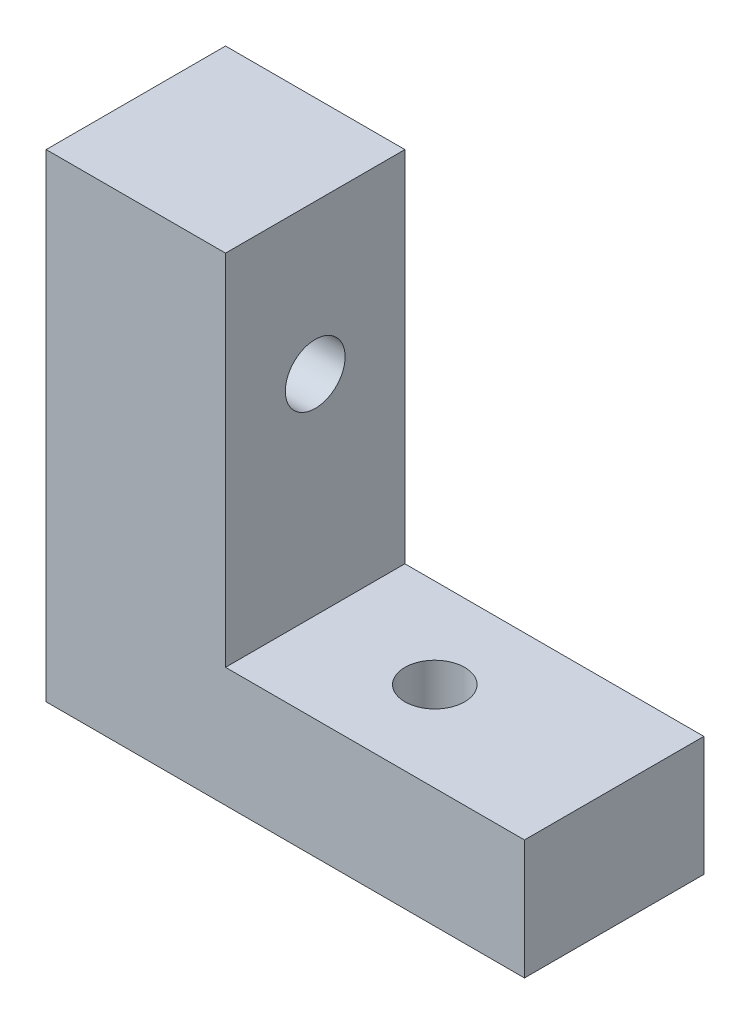
ISO-10303-21;
HEADER;
FILE_DESCRIPTION(('STEP AP214'),'2;1');
FILE_NAME('part.step','',(''),(''),'','','');
FILE_SCHEMA(('AUTOMOTIVE_DESIGN { 1 0 10303 214 1 1 1 1 }'));
ENDSEC;
DATA;
#1=APPLICATION_CONTEXT('core data for automotive mechanical design processes');
#2=APPLICATION_PROTOCOL_DEFINITION('international standard','automotive_design',2000,#1);
#3=PRODUCT_CONTEXT('',#1,'mechanical');
#4=PRODUCT('Part','Part','',(#3));
#5=PRODUCT_RELATED_PRODUCT_CATEGORY('part','',(#4));
#6=PRODUCT_DEFINITION_FORMATION('','',#4);
#7=PRODUCT_DEFINITION_CONTEXT('part definition',#1,'design');
#8=PRODUCT_DEFINITION('design','',#6,#7);
#9=PRODUCT_DEFINITION_SHAPE('','',#8);
#10=(LENGTH_UNIT() NAMED_UNIT(*) SI_UNIT(.MILLI.,.METRE.));
#11=(NAMED_UNIT(*) PLANE_ANGLE_UNIT() SI_UNIT($,.RADIAN.));
#12=(NAMED_UNIT(*) SI_UNIT($,.STERADIAN.) SOLID_ANGLE_UNIT());
#13=UNCERTAINTY_MEASURE_WITH_UNIT(LENGTH_MEASURE(1.E-05),#10,'distance_accuracy_value','');
#14=(GEOMETRIC_REPRESENTATION_CONTEXT(3) GLOBAL_UNCERTAINTY_ASSIGNED_CONTEXT((#13)) GLOBAL_UNIT_ASSIGNED_CONTEXT((#10,
#11,#12)) REPRESENTATION_CONTEXT('',''));
#15=CARTESIAN_POINT('',(0.,0.,0.));
#16=DIRECTION('',(0.,0.,1.));
#17=DIRECTION('',(1.,0.,0.));
#18=AXIS2_PLACEMENT_3D('',#15,#16,#17);
#19=CARTESIAN_POINT('',(0.,0.,30.));
#20=DIRECTION('',(1.,0.,0.));
#21=DIRECTION('',(0.,0.,-1.));
#22=AXIS2_PLACEMENT_3D('',#19,#20,#21);
#23=PLANE('',#22);
#24=CARTESIAN_POINT('',(0.,-25.,15.));
#25=DIRECTION('',(1.,0.,0.));
#26=DIRECTION('',(0.,0.,-1.));
#27=AXIS2_PLACEMENT_3D('',#24,#25,#26);
#28=CIRCLE('',#27,5.);
#29=CARTESIAN_POINT('',(0.,-25.,10.));
#30=VERTEX_POINT('',#29);
#31=EDGE_CURVE('E133',#30,#30,#28,.T.);
#32=ORIENTED_EDGE('',*,*,#31,.T.);
#33=EDGE_LOOP('',(#32));
#34=FACE_BOUND('',#33,.T.);
#35=DIRECTION('',(0.,-1.,0.));
#36=VECTOR('',#35,1.);
#37=CARTESIAN_POINT('',(0.,0.,0.));
#38=LINE('',#37,#36);
#39=CARTESIAN_POINT('',(0.,0.,0.));
#40=VERTEX_POINT('',#39);
#41=CARTESIAN_POINT('',(0.,-80.,0.));
#42=VERTEX_POINT('',#41);
#43=EDGE_CURVE('E128',#40,#42,#38,.T.);
#44=ORIENTED_EDGE('',*,*,#43,.T.);
#45=DIRECTION('',(0.,0.,-1.));
#46=VECTOR('',#45,1.);
#47=CARTESIAN_POINT('',(0.,-80.,30.));
#48=LINE('',#47,#46);
#49=CARTESIAN_POINT('',(0.,-80.,30.));
#50=VERTEX_POINT('',#49);
#51=EDGE_CURVE('E11',#50,#42,#48,.T.);
#52=ORIENTED_EDGE('',*,*,#51,.F.);
#53=DIRECTION('',(0.,-1.,0.));
#54=VECTOR('',#53,1.);
#55=CARTESIAN_POINT('',(0.,0.,30.));
#56=LINE('',#55,#54);
#57=CARTESIAN_POINT('',(0.,0.,30.));
#58=VERTEX_POINT('',#57);
#59=EDGE_CURVE('E145',#58,#50,#56,.T.);
#60=ORIENTED_EDGE('',*,*,#59,.F.);
#61=DIRECTION('',(0.,0.,-1.));
#62=VECTOR('',#61,1.);
#63=CARTESIAN_POINT('',(0.,0.,30.));
#64=LINE('',#63,#62);
#65=EDGE_CURVE('E124',#58,#40,#64,.T.);
#66=ORIENTED_EDGE('',*,*,#65,.T.);
#67=EDGE_LOOP('',(#44,#52,#60,#66));
#68=FACE_BOUND('',#67,.T.);
#69=ADVANCED_FACE('F39',(#34,#68),#23,.F.);
#70=CARTESIAN_POINT('',(30.,-80.,30.));
#71=DIRECTION('',(0.,1.,0.));
#72=DIRECTION('',(0.,0.,1.));
#73=AXIS2_PLACEMENT_3D('',#70,#71,#72);
#74=PLANE('',#73);
#75=CARTESIAN_POINT('',(50.,-80.,15.));
#76=DIRECTION('',(0.,1.,0.));
#77=DIRECTION('',(0.,0.,1.));
#78=AXIS2_PLACEMENT_3D('',#75,#76,#77);
#79=CIRCLE('',#78,5.);
#80=CARTESIAN_POINT('',(50.,-80.,20.));
#81=VERTEX_POINT('',#80);
#82=EDGE_CURVE('E188',#81,#81,#79,.T.);
#83=ORIENTED_EDGE('',*,*,#82,.T.);
#84=EDGE_LOOP('',(#83));
#85=FACE_BOUND('',#84,.T.);
#86=DIRECTION('',(1.,0.,0.));
#87=VECTOR('',#86,1.);
#88=CARTESIAN_POINT('',(30.,-80.,0.));
#89=LINE('',#88,#87);
#90=CARTESIAN_POINT('',(80.,-80.,0.));
#91=VERTEX_POINT('',#90);
#92=EDGE_CURVE('E132',#42,#91,#89,.T.);
#93=ORIENTED_EDGE('',*,*,#92,.T.);
#94=DIRECTION('',(0.,0.,-1.));
#95=VECTOR('',#94,1.);
#96=CARTESIAN_POINT('',(80.,-80.,30.));
#97=LINE('',#96,#95);
#98=CARTESIAN_POINT('',(80.,-80.,30.));
#99=VERTEX_POINT('',#98);
#100=EDGE_CURVE('E48',#99,#91,#97,.T.);
#101=ORIENTED_EDGE('',*,*,#100,.F.);
#102=DIRECTION('',(1.,0.,0.));
#103=VECTOR('',#102,1.);
#104=CARTESIAN_POINT('',(0.,-80.,30.));
#105=LINE('',#104,#103);
#106=EDGE_CURVE('E93',#50,#99,#105,.T.);
#107=ORIENTED_EDGE('',*,*,#106,.F.);
#108=ORIENTED_EDGE('',*,*,#51,.T.);
#109=EDGE_LOOP('',(#93,#101,#107,#108));
#110=FACE_BOUND('',#109,.T.);
#111=ADVANCED_FACE('F174',(#85,#110),#74,.F.);
#112=CARTESIAN_POINT('',(80.,-80.,30.));
#113=DIRECTION('',(-1.,0.,0.));
#114=DIRECTION('',(0.,0.,1.));
#115=AXIS2_PLACEMENT_3D('',#112,#113,#114);
#116=PLANE('',#115);
#117=DIRECTION('',(0.,1.,0.));
#118=VECTOR('',#117,1.);
#119=CARTESIAN_POINT('',(80.,-80.,0.));
#120=LINE('',#119,#118);
#121=CARTESIAN_POINT('',(80.,-60.,0.));
#122=VERTEX_POINT('',#121);
#123=EDGE_CURVE('E136',#91,#122,#120,.T.);
#124=ORIENTED_EDGE('',*,*,#123,.T.);
#125=DIRECTION('',(0.,0.,-1.));
#126=VECTOR('',#125,1.);
#127=CARTESIAN_POINT('',(80.,-60.,30.));
#128=LINE('',#127,#126);
#129=CARTESIAN_POINT('',(80.,-60.,30.));
#130=VERTEX_POINT('',#129);
#131=EDGE_CURVE('E117',#130,#122,#128,.T.);
#132=ORIENTED_EDGE('',*,*,#131,.F.);
#133=DIRECTION('',(0.,1.,0.));
#134=VECTOR('',#133,1.);
#135=CARTESIAN_POINT('',(80.,-80.,30.));
#136=LINE('',#135,#134);
#137=EDGE_CURVE('E106',#99,#130,#136,.T.);
#138=ORIENTED_EDGE('',*,*,#137,.F.);
#139=ORIENTED_EDGE('',*,*,#100,.T.);
#140=EDGE_LOOP('',(#124,#132,#138,#139));
#141=FACE_BOUND('',#140,.T.);
#142=ADVANCED_FACE('F155',(#141),#116,.F.);
#143=CARTESIAN_POINT('',(30.,-60.,30.));
#144=DIRECTION('',(0.,-1.,0.));
#145=DIRECTION('',(0.,0.,-1.));
#146=AXIS2_PLACEMENT_3D('',#143,#144,#145);
#147=PLANE('',#146);
#148=CARTESIAN_POINT('',(50.,-60.,15.));
#149=DIRECTION('',(0.,1.,0.));
#150=DIRECTION('',(0.,0.,1.));
#151=AXIS2_PLACEMENT_3D('',#148,#149,#150);
#152=CIRCLE('',#151,5.);
#153=CARTESIAN_POINT('',(50.,-60.,20.));
#154=VERTEX_POINT('',#153);
#155=EDGE_CURVE('E199',#154,#154,#152,.T.);
#156=ORIENTED_EDGE('',*,*,#155,.F.);
#157=EDGE_LOOP('',(#156));
#158=FACE_BOUND('',#157,.T.);
#159=DIRECTION('',(-1.,0.,0.));
#160=VECTOR('',#159,1.);
#161=CARTESIAN_POINT('',(30.,-60.,0.));
#162=LINE('',#161,#160);
#163=CARTESIAN_POINT('',(30.,-60.,0.));
#164=VERTEX_POINT('',#163);
#165=EDGE_CURVE('E115',#122,#164,#162,.T.);
#166=ORIENTED_EDGE('',*,*,#165,.T.);
#167=DIRECTION('',(0.,0.,-1.));
#168=VECTOR('',#167,1.);
#169=CARTESIAN_POINT('',(30.,-60.,30.));
#170=LINE('',#169,#168);
#171=CARTESIAN_POINT('',(30.,-60.,30.));
#172=VERTEX_POINT('',#171);
#173=EDGE_CURVE('E112',#172,#164,#170,.T.);
#174=ORIENTED_EDGE('',*,*,#173,.F.);
#175=DIRECTION('',(-1.,0.,0.));
#176=VECTOR('',#175,1.);
#177=CARTESIAN_POINT('',(30.,-60.,30.));
#178=LINE('',#177,#176);
#179=EDGE_CURVE('E100',#130,#172,#178,.T.);
#180=ORIENTED_EDGE('',*,*,#179,.F.);
#181=ORIENTED_EDGE('',*,*,#131,.T.);
#182=EDGE_LOOP('',(#166,#174,#180,#181));
#183=FACE_BOUND('',#182,.T.);
#184=ADVANCED_FACE('F113',(#158,#183),#147,.F.);
#185=CARTESIAN_POINT('',(30.,0.,30.));
#186=DIRECTION('',(-1.,0.,0.));
#187=DIRECTION('',(0.,0.,1.));
#188=AXIS2_PLACEMENT_3D('',#185,#186,#187);
#189=PLANE('',#188);
#190=CARTESIAN_POINT('',(30.,-25.,15.));
#191=DIRECTION('',(1.,0.,0.));
#192=DIRECTION('',(0.,0.,-1.));
#193=AXIS2_PLACEMENT_3D('',#190,#191,#192);
#194=CIRCLE('',#193,5.);
#195=CARTESIAN_POINT('',(30.,-25.,10.));
#196=VERTEX_POINT('',#195);
#197=EDGE_CURVE('E184',#196,#196,#194,.T.);
#198=ORIENTED_EDGE('',*,*,#197,.F.);
#199=EDGE_LOOP('',(#198));
#200=FACE_BOUND('',#199,.T.);
#201=DIRECTION('',(0.,1.,0.));
#202=VECTOR('',#201,1.);
#203=CARTESIAN_POINT('',(30.,0.,0.));
#204=LINE('',#203,#202);
#205=CARTESIAN_POINT('',(30.,0.,0.));
#206=VERTEX_POINT('',#205);
#207=EDGE_CURVE('E79',#164,#206,#204,.T.);
#208=ORIENTED_EDGE('',*,*,#207,.T.);
#209=DIRECTION('',(0.,0.,-1.));
#210=VECTOR('',#209,1.);
#211=CARTESIAN_POINT('',(30.,0.,30.));
#212=LINE('',#211,#210);
#213=CARTESIAN_POINT('',(30.,0.,30.));
#214=VERTEX_POINT('',#213);
#215=EDGE_CURVE('E118',#214,#206,#212,.T.);
#216=ORIENTED_EDGE('',*,*,#215,.F.);
#217=DIRECTION('',(0.,1.,0.));
#218=VECTOR('',#217,1.);
#219=CARTESIAN_POINT('',(30.,0.,30.));
#220=LINE('',#219,#218);
#221=EDGE_CURVE('E104',#172,#214,#220,.T.);
#222=ORIENTED_EDGE('',*,*,#221,.F.);
#223=ORIENTED_EDGE('',*,*,#173,.T.);
#224=EDGE_LOOP('',(#208,#216,#222,#223));
#225=FACE_BOUND('',#224,.T.);
#226=ADVANCED_FACE('F120',(#200,#225),#189,.F.);
#227=CARTESIAN_POINT('',(0.,0.,30.));
#228=DIRECTION('',(0.,-1.,0.));
#229=DIRECTION('',(0.,0.,-1.));
#230=AXIS2_PLACEMENT_3D('',#227,#228,#229);
#231=PLANE('',#230);
#232=DIRECTION('',(-1.,0.,0.));
#233=VECTOR('',#232,1.);
#234=CARTESIAN_POINT('',(0.,0.,0.));
#235=LINE('',#234,#233);
#236=EDGE_CURVE('E85',#206,#40,#235,.T.);
#237=ORIENTED_EDGE('',*,*,#236,.T.);
#238=ORIENTED_EDGE('',*,*,#65,.F.);
#239=DIRECTION('',(-1.,0.,0.));
#240=VECTOR('',#239,1.);
#241=CARTESIAN_POINT('',(0.,0.,30.));
#242=LINE('',#241,#240);
#243=EDGE_CURVE('E56',#214,#58,#242,.T.);
#244=ORIENTED_EDGE('',*,*,#243,.F.);
#245=ORIENTED_EDGE('',*,*,#215,.T.);
#246=EDGE_LOOP('',(#237,#238,#244,#245));
#247=FACE_BOUND('',#246,.T.);
#248=ADVANCED_FACE('F162',(#247),#231,.F.);
#249=CARTESIAN_POINT('',(0.,0.,30.));
#250=DIRECTION('',(0.,0.,1.));
#251=DIRECTION('',(1.,0.,0.));
#252=AXIS2_PLACEMENT_3D('',#249,#250,#251);
#253=PLANE('',#252);
#254=ORIENTED_EDGE('',*,*,#59,.T.);
#255=ORIENTED_EDGE('',*,*,#106,.T.);
#256=ORIENTED_EDGE('',*,*,#137,.T.);
#257=ORIENTED_EDGE('',*,*,#179,.T.);
#258=ORIENTED_EDGE('',*,*,#221,.T.);
#259=ORIENTED_EDGE('',*,*,#243,.T.);
#260=EDGE_LOOP('',(#254,#255,#256,#257,#258,#259));
#261=FACE_BOUND('',#260,.T.);
#262=ADVANCED_FACE('F102',(#261),#253,.T.);
#263=CARTESIAN_POINT('',(0.,0.,0.));
#264=DIRECTION('',(0.,0.,1.));
#265=DIRECTION('',(1.,0.,0.));
#266=AXIS2_PLACEMENT_3D('',#263,#264,#265);
#267=PLANE('',#266);
#268=ORIENTED_EDGE('',*,*,#43,.F.);
#269=ORIENTED_EDGE('',*,*,#236,.F.);
#270=ORIENTED_EDGE('',*,*,#207,.F.);
#271=ORIENTED_EDGE('',*,*,#165,.F.);
#272=ORIENTED_EDGE('',*,*,#123,.F.);
#273=ORIENTED_EDGE('',*,*,#92,.F.);
#274=EDGE_LOOP('',(#268,#269,#270,#271,#272,#273));
#275=FACE_BOUND('',#274,.T.);
#276=ADVANCED_FACE('F158',(#275),#267,.F.);
#277=CARTESIAN_POINT('',(-10.,-25.,15.));
#278=DIRECTION('',(1.,0.,0.));
#279=DIRECTION('',(0.,0.,-1.));
#280=AXIS2_PLACEMENT_3D('',#277,#278,#279);
#281=CYLINDRICAL_SURFACE('',#280,5.);
#282=ORIENTED_EDGE('',*,*,#197,.T.);
#283=EDGE_LOOP('',(#282));
#284=FACE_BOUND('',#283,.T.);
#285=ORIENTED_EDGE('',*,*,#31,.F.);
#286=EDGE_LOOP('',(#285));
#287=FACE_BOUND('',#286,.T.);
#288=ADVANCED_FACE('F225',(#284,#287),#281,.F.);
#289=CARTESIAN_POINT('',(50.,-100.,15.));
#290=DIRECTION('',(0.,1.,0.));
#291=DIRECTION('',(0.,0.,1.));
#292=AXIS2_PLACEMENT_3D('',#289,#290,#291);
#293=CYLINDRICAL_SURFACE('',#292,5.);
#294=ORIENTED_EDGE('',*,*,#155,.T.);
#295=EDGE_LOOP('',(#294));
#296=FACE_BOUND('',#295,.T.);
#297=ORIENTED_EDGE('',*,*,#82,.F.);
#298=EDGE_LOOP('',(#297));
#299=FACE_BOUND('',#298,.T.);
#300=ADVANCED_FACE('F204',(#296,#299),#293,.F.);
#301=CLOSED_SHELL('',(#69,#111,#142,#184,#226,#248,#262,#276,#288,#300));
#302=MANIFOLD_SOLID_BREP('B2',#301);
#303=ADVANCED_BREP_SHAPE_REPRESENTATION('',(#18,#302),#14);
#304=SHAPE_DEFINITION_REPRESENTATION(#9,#303);
ENDSEC;
END-ISO-10303-21;
